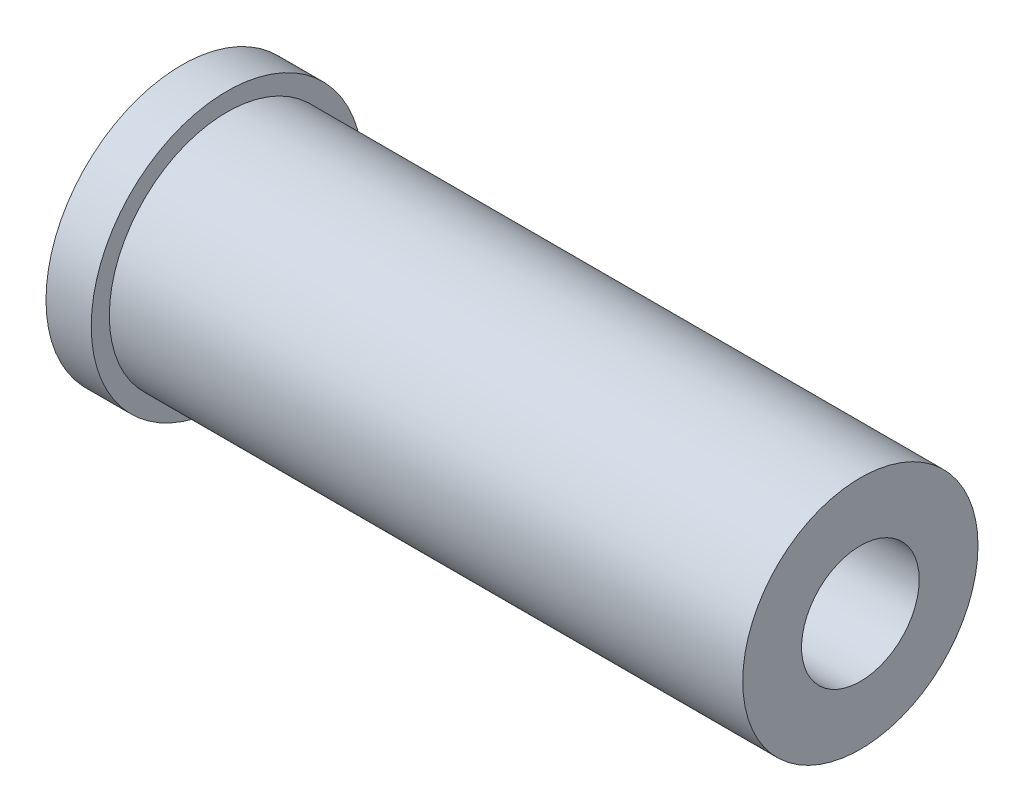
ISO-10303-21;
HEADER;
FILE_DESCRIPTION(('STEP AP214'),'2;1');
FILE_NAME('part.step','',(''),(''),'','','');
FILE_SCHEMA(('AUTOMOTIVE_DESIGN { 1 0 10303 214 1 1 1 1 }'));
ENDSEC;
DATA;
#1=APPLICATION_CONTEXT('core data for automotive mechanical design processes');
#2=APPLICATION_PROTOCOL_DEFINITION('international standard','automotive_design',2000,#1);
#3=PRODUCT_CONTEXT('',#1,'mechanical');
#4=PRODUCT('Part','Part','',(#3));
#5=PRODUCT_RELATED_PRODUCT_CATEGORY('part','',(#4));
#6=PRODUCT_DEFINITION_FORMATION('','',#4);
#7=PRODUCT_DEFINITION_CONTEXT('part definition',#1,'design');
#8=PRODUCT_DEFINITION('design','',#6,#7);
#9=PRODUCT_DEFINITION_SHAPE('','',#8);
#10=(LENGTH_UNIT() NAMED_UNIT(*) SI_UNIT(.MILLI.,.METRE.));
#11=(NAMED_UNIT(*) PLANE_ANGLE_UNIT() SI_UNIT($,.RADIAN.));
#12=(NAMED_UNIT(*) SI_UNIT($,.STERADIAN.) SOLID_ANGLE_UNIT());
#13=UNCERTAINTY_MEASURE_WITH_UNIT(LENGTH_MEASURE(1.E-05),#10,'distance_accuracy_value','');
#14=(GEOMETRIC_REPRESENTATION_CONTEXT(3) GLOBAL_UNCERTAINTY_ASSIGNED_CONTEXT((#13)) GLOBAL_UNIT_ASSIGNED_CONTEXT((#10,
#11,#12)) REPRESENTATION_CONTEXT('',''));
#15=CARTESIAN_POINT('',(0.,0.,0.));
#16=DIRECTION('',(0.,0.,1.));
#17=DIRECTION('',(1.,0.,0.));
#18=AXIS2_PLACEMENT_3D('',#15,#16,#17);
#19=CARTESIAN_POINT('',(-20.5,32.9494473784286,-40.3528271719667));
#20=DIRECTION('',(-1.,0.,0.));
#21=DIRECTION('',(0.,0.,1.));
#22=AXIS2_PLACEMENT_3D('',#19,#20,#21);
#23=PLANE('',#22);
#24=CARTESIAN_POINT('',(-20.5,32.8888888888889,-41.));
#25=DIRECTION('',(1.,0.,0.));
#26=DIRECTION('',(0.,0.,-1.));
#27=AXIS2_PLACEMENT_3D('',#24,#25,#26);
#28=CIRCLE('',#27,0.649999999999997);
#29=CARTESIAN_POINT('',(-20.5,32.8888888888889,-41.65));
#30=VERTEX_POINT('',#29);
#31=EDGE_CURVE('E53',#30,#30,#28,.T.);
#32=ORIENTED_EDGE('',*,*,#31,.T.);
#33=EDGE_LOOP('',(#32));
#34=FACE_BOUND('',#33,.T.);
#35=ADVANCED_FACE('F31',(#34),#23,.F.);
#36=CARTESIAN_POINT('',(-21.5,32.8888888888889,-41.));
#37=DIRECTION('',(1.,0.,0.));
#38=DIRECTION('',(0.,0.,-1.));
#39=AXIS2_PLACEMENT_3D('',#36,#37,#38);
#40=PLANE('',#39);
#41=CARTESIAN_POINT('',(-21.5,32.8888888888889,-41.));
#42=DIRECTION('',(1.,0.,0.));
#43=DIRECTION('',(0.,0.,-1.));
#44=AXIS2_PLACEMENT_3D('',#41,#42,#43);
#45=CIRCLE('',#44,1.5);
#46=CARTESIAN_POINT('',(-21.5,32.8888888888889,-42.5));
#47=VERTEX_POINT('',#46);
#48=EDGE_CURVE('E10',#47,#47,#45,.T.);
#49=ORIENTED_EDGE('',*,*,#48,.F.);
#50=EDGE_LOOP('',(#49));
#51=FACE_BOUND('',#50,.T.);
#52=ADVANCED_FACE('F83',(#51),#40,.F.);
#53=CARTESIAN_POINT('',(-14.,32.8888888888889,-41.));
#54=DIRECTION('',(1.,0.,0.));
#55=DIRECTION('',(0.,0.,-1.));
#56=AXIS2_PLACEMENT_3D('',#53,#54,#55);
#57=CYLINDRICAL_SURFACE('',#56,1.5);
#58=CARTESIAN_POINT('',(-21.,32.8888888888889,-41.));
#59=DIRECTION('',(1.,0.,0.));
#60=DIRECTION('',(0.,0.,-1.));
#61=AXIS2_PLACEMENT_3D('',#58,#59,#60);
#62=CIRCLE('',#61,1.5);
#63=CARTESIAN_POINT('',(-21.,32.8888888888889,-42.5));
#64=VERTEX_POINT('',#63);
#65=EDGE_CURVE('E37',#64,#64,#62,.T.);
#66=ORIENTED_EDGE('',*,*,#65,.F.);
#67=EDGE_LOOP('',(#66));
#68=FACE_BOUND('',#67,.T.);
#69=ORIENTED_EDGE('',*,*,#48,.T.);
#70=EDGE_LOOP('',(#69));
#71=FACE_BOUND('',#70,.T.);
#72=ADVANCED_FACE('F78',(#68,#71),#57,.T.);
#73=CARTESIAN_POINT('',(-21.,33.0100058679682,-39.7056543439333));
#74=DIRECTION('',(-1.,0.,0.));
#75=DIRECTION('',(0.,0.,1.));
#76=AXIS2_PLACEMENT_3D('',#73,#74,#75);
#77=PLANE('',#76);
#78=CARTESIAN_POINT('',(-21.,32.8888888888889,-41.));
#79=DIRECTION('',(1.,0.,0.));
#80=DIRECTION('',(0.,0.,-1.));
#81=AXIS2_PLACEMENT_3D('',#78,#79,#80);
#82=CIRCLE('',#81,1.3);
#83=CARTESIAN_POINT('',(-21.,32.8888888888889,-42.3));
#84=VERTEX_POINT('',#83);
#85=EDGE_CURVE('E41',#84,#84,#82,.T.);
#86=ORIENTED_EDGE('',*,*,#85,.F.);
#87=EDGE_LOOP('',(#86));
#88=FACE_BOUND('',#87,.T.);
#89=ORIENTED_EDGE('',*,*,#65,.T.);
#90=EDGE_LOOP('',(#89));
#91=FACE_BOUND('',#90,.T.);
#92=ADVANCED_FACE('F73',(#88,#91),#77,.F.);
#93=CARTESIAN_POINT('',(-14.,32.8888888888889,-41.));
#94=DIRECTION('',(1.,0.,0.));
#95=DIRECTION('',(0.,0.,-1.));
#96=AXIS2_PLACEMENT_3D('',#93,#94,#95);
#97=CYLINDRICAL_SURFACE('',#96,1.3);
#98=CARTESIAN_POINT('',(-14.,32.8888888888889,-41.));
#99=DIRECTION('',(1.,0.,0.));
#100=DIRECTION('',(0.,0.,-1.));
#101=AXIS2_PLACEMENT_3D('',#98,#99,#100);
#102=CIRCLE('',#101,1.3);
#103=CARTESIAN_POINT('',(-14.,32.8888888888889,-42.3));
#104=VERTEX_POINT('',#103);
#105=EDGE_CURVE('E45',#104,#104,#102,.T.);
#106=ORIENTED_EDGE('',*,*,#105,.F.);
#107=EDGE_LOOP('',(#106));
#108=FACE_BOUND('',#107,.T.);
#109=ORIENTED_EDGE('',*,*,#85,.T.);
#110=EDGE_LOOP('',(#109));
#111=FACE_BOUND('',#110,.T.);
#112=ADVANCED_FACE('F67',(#108,#111),#97,.T.);
#113=CARTESIAN_POINT('',(-14.,32.9494473784286,-40.3528271719667));
#114=DIRECTION('',(-1.,0.,0.));
#115=DIRECTION('',(0.,0.,1.));
#116=AXIS2_PLACEMENT_3D('',#113,#114,#115);
#117=PLANE('',#116);
#118=CARTESIAN_POINT('',(-14.,32.8888888888889,-41.));
#119=DIRECTION('',(1.,0.,0.));
#120=DIRECTION('',(0.,0.,-1.));
#121=AXIS2_PLACEMENT_3D('',#118,#119,#120);
#122=CIRCLE('',#121,0.649999999999997);
#123=CARTESIAN_POINT('',(-14.,32.8888888888889,-41.65));
#124=VERTEX_POINT('',#123);
#125=EDGE_CURVE('E50',#124,#124,#122,.T.);
#126=ORIENTED_EDGE('',*,*,#125,.F.);
#127=EDGE_LOOP('',(#126));
#128=FACE_BOUND('',#127,.T.);
#129=ORIENTED_EDGE('',*,*,#105,.T.);
#130=EDGE_LOOP('',(#129));
#131=FACE_BOUND('',#130,.T.);
#132=ADVANCED_FACE('F61',(#128,#131),#117,.F.);
#133=CARTESIAN_POINT('',(-14.,32.8888888888889,-41.));
#134=DIRECTION('',(1.,0.,0.));
#135=DIRECTION('',(0.,0.,-1.));
#136=AXIS2_PLACEMENT_3D('',#133,#134,#135);
#137=CYLINDRICAL_SURFACE('',#136,0.649999999999997);
#138=ORIENTED_EDGE('',*,*,#31,.F.);
#139=EDGE_LOOP('',(#138));
#140=FACE_BOUND('',#139,.T.);
#141=ORIENTED_EDGE('',*,*,#125,.T.);
#142=EDGE_LOOP('',(#141));
#143=FACE_BOUND('',#142,.T.);
#144=ADVANCED_FACE('F58',(#140,#143),#137,.F.);
#145=CLOSED_SHELL('',(#35,#52,#72,#92,#112,#132,#144));
#146=MANIFOLD_SOLID_BREP('B2',#145);
#147=ADVANCED_BREP_SHAPE_REPRESENTATION('',(#18,#146),#14);
#148=SHAPE_DEFINITION_REPRESENTATION(#9,#147);
ENDSEC;
END-ISO-10303-21;
